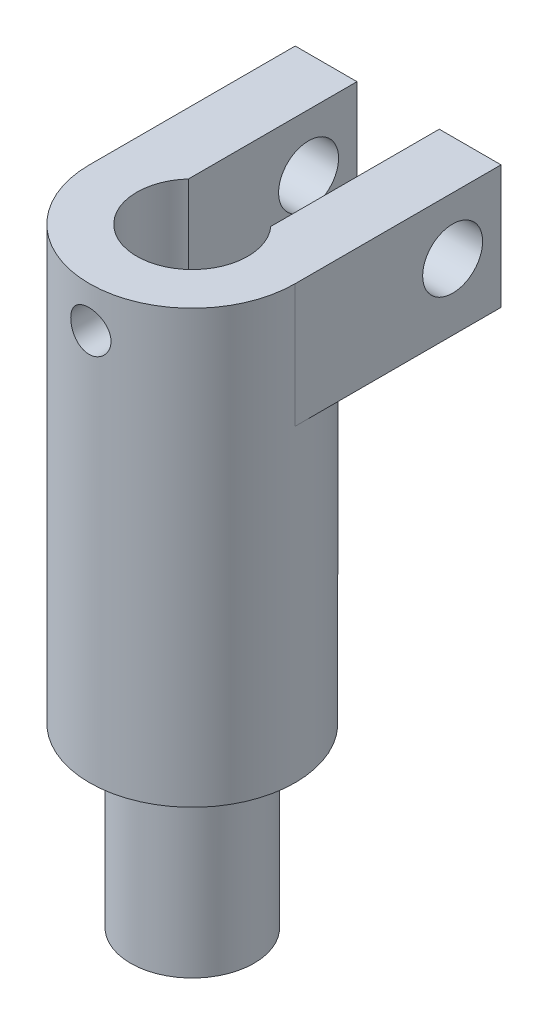
ISO-10303-21;
HEADER;
FILE_DESCRIPTION(('STEP AP214'),'2;1');
FILE_NAME('part.step','',(''),(''),'','','');
FILE_SCHEMA(('AUTOMOTIVE_DESIGN { 1 0 10303 214 1 1 1 1 }'));
ENDSEC;
DATA;
#1=APPLICATION_CONTEXT('core data for automotive mechanical design processes');
#2=APPLICATION_PROTOCOL_DEFINITION('international standard','automotive_design',2000,#1);
#3=PRODUCT_CONTEXT('',#1,'mechanical');
#4=PRODUCT('Part','Part','',(#3));
#5=PRODUCT_RELATED_PRODUCT_CATEGORY('part','',(#4));
#6=PRODUCT_DEFINITION_FORMATION('','',#4);
#7=PRODUCT_DEFINITION_CONTEXT('part definition',#1,'design');
#8=PRODUCT_DEFINITION('design','',#6,#7);
#9=PRODUCT_DEFINITION_SHAPE('','',#8);
#10=(LENGTH_UNIT() NAMED_UNIT(*) SI_UNIT(.MILLI.,.METRE.));
#11=(NAMED_UNIT(*) PLANE_ANGLE_UNIT() SI_UNIT($,.RADIAN.));
#12=(NAMED_UNIT(*) SI_UNIT($,.STERADIAN.) SOLID_ANGLE_UNIT());
#13=UNCERTAINTY_MEASURE_WITH_UNIT(LENGTH_MEASURE(1.E-05),#10,'distance_accuracy_value','');
#14=(GEOMETRIC_REPRESENTATION_CONTEXT(3) GLOBAL_UNCERTAINTY_ASSIGNED_CONTEXT((#13)) GLOBAL_UNIT_ASSIGNED_CONTEXT((#10,
#11,#12)) REPRESENTATION_CONTEXT('',''));
#15=CARTESIAN_POINT('',(0.,0.,0.));
#16=DIRECTION('',(0.,0.,1.));
#17=DIRECTION('',(1.,0.,0.));
#18=AXIS2_PLACEMENT_3D('',#15,#16,#17);
#19=CARTESIAN_POINT('',(0.,19.05,0.));
#20=DIRECTION('',(0.,-1.,0.));
#21=DIRECTION('',(0.,0.,-1.));
#22=AXIS2_PLACEMENT_3D('',#19,#20,#21);
#23=CYLINDRICAL_SURFACE('',#22,6.35);
#24=CARTESIAN_POINT('',(1.21684521758331,24.1305728565034,6.23231800508002));
#25=CARTESIAN_POINT('',(1.21684261587254,24.0610935812906,6.23231936501521));
#26=CARTESIAN_POINT('',(1.21102652927377,23.9915813792861,6.23346277432744));
#27=CARTESIAN_POINT('',(1.18793481084357,23.8545217857291,6.23790381193194));
#28=CARTESIAN_POINT('',(1.17064986752788,23.7869760372804,6.24120319060754));
#29=CARTESIAN_POINT('',(1.12517735145092,23.6558521418449,6.24956049252496));
#30=CARTESIAN_POINT('',(1.09700044506115,23.5922701836861,6.25461669484159));
#31=CARTESIAN_POINT('',(1.03057512420649,23.4707337302349,6.26590335020237));
#32=CARTESIAN_POINT('',(0.992327329270661,23.4127788890801,6.2721337310081));
#33=CARTESIAN_POINT('',(0.906290105442708,23.303344249157,6.28514511400288));
#34=CARTESIAN_POINT('',(0.85838918994204,23.2519527796697,6.29193194212927));
#35=CARTESIAN_POINT('',(0.754649736987168,23.1578744301423,6.30521477535255));
#36=CARTESIAN_POINT('',(0.698810652833277,23.1151881501197,6.31171076037859));
#37=CARTESIAN_POINT('',(0.580198912301908,23.0393902322941,6.32372095716737));
#38=CARTESIAN_POINT('',(0.517371761218049,23.006362364369,6.32922642859708));
#39=CARTESIAN_POINT('',(0.386934397922873,22.9513591454428,6.33853700354256));
#40=CARTESIAN_POINT('',(0.31932461997357,22.9293827924308,6.3423422612086));
#41=CARTESIAN_POINT('',(0.182159627580712,22.8973809278278,6.34775286757285));
#42=CARTESIAN_POINT('',(0.112640302028554,22.8872063246456,6.34938570022244));
#43=CARTESIAN_POINT('',(-0.0271332978839639,22.8786317778989,6.35032644425796));
#44=CARTESIAN_POINT('',(-0.0973875029326157,22.8802307337092,6.34963457296697));
#45=CARTESIAN_POINT('',(-0.235612908961461,22.8950445105335,6.34599899004458));
#46=CARTESIAN_POINT('',(-0.303602235482833,22.908098751961,6.3430864809231));
#47=CARTESIAN_POINT('',(-0.436395572457386,22.9451980247793,6.3353362618724));
#48=CARTESIAN_POINT('',(-0.501199458200458,22.9692434860978,6.33049847663591));
#49=CARTESIAN_POINT('',(-0.626244171054954,23.0277924894609,6.31935808623323));
#50=CARTESIAN_POINT('',(-0.686454572423691,23.0623592721494,6.31304667850881));
#51=CARTESIAN_POINT('',(-0.800275133784891,23.1409229497347,6.29963086367204));
#52=CARTESIAN_POINT('',(-0.853884555893777,23.1849208973805,6.29252636807413));
#53=CARTESIAN_POINT('',(-0.953936194768653,23.281979913835,6.27814525323135));
#54=CARTESIAN_POINT('',(-1.00024206643724,23.3351815054548,6.27086775351528));
#55=CARTESIAN_POINT('',(-1.08329948369989,23.4486720500017,6.25705524320718));
#56=CARTESIAN_POINT('',(-1.12005085967777,23.5089611287219,6.25052024579759));
#57=CARTESIAN_POINT('',(-1.18300380605068,23.6351071847573,6.23891285709015));
#58=CARTESIAN_POINT('',(-1.20918390404575,23.7009751691129,6.2338434485689));
#59=CARTESIAN_POINT('',(-1.25007645516499,23.8362987798549,6.22577285757166));
#60=CARTESIAN_POINT('',(-1.26479035212137,23.9057539533652,6.22277141470148));
#61=CARTESIAN_POINT('',(-1.28213186735071,24.0450462877231,6.21922148028519));
#62=CARTESIAN_POINT('',(-1.28495590050041,24.1148580062266,6.21863312985599));
#63=CARTESIAN_POINT('',(-1.27896579689437,24.2539556380752,6.21986780655312));
#64=CARTESIAN_POINT('',(-1.27015229817714,24.323241580037,6.22169070148069));
#65=CARTESIAN_POINT('',(-1.24130565002856,24.4586637213851,6.2275092349967));
#66=CARTESIAN_POINT('',(-1.22137694226979,24.524823112148,6.23148463799522));
#67=CARTESIAN_POINT('',(-1.17097531614875,24.6528603728247,6.24115143771146));
#68=CARTESIAN_POINT('',(-1.14050155244561,24.714737899007,6.24684297199757));
#69=CARTESIAN_POINT('',(-1.06942583608198,24.8333168385259,6.25940430769089));
#70=CARTESIAN_POINT('',(-1.02870062028006,24.8899428592418,6.26628810539752));
#71=CARTESIAN_POINT('',(-0.938439745086084,24.9956227777171,6.28043890940152));
#72=CARTESIAN_POINT('',(-0.888903208579268,25.0446759207326,6.28770595379812));
#73=CARTESIAN_POINT('',(-0.7815418653437,25.1345603253641,6.30195701712605));
#74=CARTESIAN_POINT('',(-0.723605006480432,25.1752588234249,6.30893523824578));
#75=CARTESIAN_POINT('',(-0.601596313151397,25.2463381801802,6.32173542741158));
#76=CARTESIAN_POINT('',(-0.537524731190133,25.2767194632963,6.32755744301665));
#77=CARTESIAN_POINT('',(-0.405416329000121,25.3261071151362,6.33738876061472));
#78=CARTESIAN_POINT('',(-0.337403894298544,25.3451766331101,6.34140809496416));
#79=CARTESIAN_POINT('',(-0.199050821647502,25.3715999126203,6.3472567811785));
#80=CARTESIAN_POINT('',(-0.128710455913117,25.3789550390648,6.34908638817441));
#81=CARTESIAN_POINT('',(0.011033059095354,25.3816892628891,6.35036845805138));
#82=CARTESIAN_POINT('',(0.0804320133754336,25.3772681979364,6.34986048198307));
#83=CARTESIAN_POINT('',(0.217489219952048,25.3570158580192,6.34664466466648));
#84=CARTESIAN_POINT('',(0.285147492738241,25.3411847174271,6.34393684932486));
#85=CARTESIAN_POINT('',(0.416681733376486,25.2986492641783,6.33665602877347));
#86=CARTESIAN_POINT('',(0.480565475213622,25.2719682603485,6.33208702193665));
#87=CARTESIAN_POINT('',(0.602985840305976,25.208515370521,6.32160479305524));
#88=CARTESIAN_POINT('',(0.661522056813175,25.1717427177741,6.31569146887717));
#89=CARTESIAN_POINT('',(0.772573782672892,25.0884727172897,6.30307907403932));
#90=CARTESIAN_POINT('',(0.824980594623876,25.0418320355287,6.29636914431578));
#91=CARTESIAN_POINT('',(0.921292744849762,24.9404452025644,6.28300005396996));
#92=CARTESIAN_POINT('',(0.96519607093643,24.885697138298,6.27634090572138));
#93=CARTESIAN_POINT('',(1.04368340159875,24.7689687739532,6.26377087728518));
#94=CARTESIAN_POINT('',(1.0781660123393,24.706919344407,6.25786847544866));
#95=CARTESIAN_POINT('',(1.13615349983306,24.5778109724903,6.24760189239332));
#96=CARTESIAN_POINT('',(1.1596684395246,24.5107566879207,6.24323630204161));
#97=CARTESIAN_POINT('',(1.19043439712732,24.3913775561549,6.23743042635978));
#98=CARTESIAN_POINT('',(1.2003208819913,24.3397383884156,6.23552525115882));
#99=CARTESIAN_POINT('',(1.21352716887615,24.2355966856297,6.23296854688181));
#100=CARTESIAN_POINT('',(1.21684718428905,24.1830941786952,6.23231697706708));
#101=CARTESIAN_POINT('',(1.21684521758331,24.1305728565034,6.23231800508002));
#102=B_SPLINE_CURVE_WITH_KNOTS('',3,(#24,#25,#26,#27,#28,#29,#30,#31,#32,#33,#34,#35,#36,#37,
#38,#39,#40,#41,#42,#43,#44,#45,#46,#47,#48,#49,#50,#51,#52,#53,#54,#55,#56,#57,#58,#59,#60,#61,
#62,#63,#64,#65,#66,#67,#68,#69,#70,#71,#72,#73,#74,#75,#76,#77,#78,#79,#80,#81,#82,#83,#84,#85,
#86,#87,#88,#89,#90,#91,#92,#93,#94,#95,#96,#97,#98,#99,#100,#101),.UNSPECIFIED.,.T.,.F.,(4,2,2,
2,2,2,2,2,2,2,2,2,2,2,2,2,2,2,2,2,2,2,2,2,2,2,2,2,2,2,2,2,2,2,2,2,2,2,4),(0.,0.208245547253058,
0.416660374824381,0.624871619155631,0.833070057984128,1.04382718376134,1.25459883136701,
1.46714773742559,1.67967736877747,1.88949181939235,2.09928665621642,2.30618675357124,
2.51309494463053,2.72127221912448,2.92947274341199,3.14118972183833,3.35291045851377,
3.56505910524068,3.77718103373993,3.98578471554462,4.19437696093309,4.40104145434086,
4.60772251877809,4.8170184971263,5.0263353213202,5.23875728413995,5.45117050745142,
5.66238646820454,5.87357781722348,6.08120825351499,6.28883624465786,6.49602052413559,
6.70322054954174,6.91366685640683,7.12416290071183,7.33684243187158,7.54932644188322,
7.70675017578221,7.86416879376241),.UNSPECIFIED.);
#103=CARTESIAN_POINT('',(1.21684521758331,24.1305728565034,6.23231800508002));
#104=VERTEX_POINT('',#103);
#105=EDGE_CURVE('E11',#104,#104,#102,.T.);
#106=ORIENTED_EDGE('',*,*,#105,.T.);
#107=EDGE_LOOP('',(#106));
#108=FACE_BOUND('',#107,.T.);
#109=CARTESIAN_POINT('',(0.,0.,0.));
#110=DIRECTION('',(0.,1.,0.));
#111=DIRECTION('',(0.,0.,1.));
#112=AXIS2_PLACEMENT_3D('',#109,#110,#111);
#113=CIRCLE('',#112,6.35);
#114=CARTESIAN_POINT('',(0.,0.,6.35));
#115=VERTEX_POINT('',#114);
#116=EDGE_CURVE('E203',#115,#115,#113,.T.);
#117=ORIENTED_EDGE('',*,*,#116,.T.);
#118=EDGE_LOOP('',(#117));
#119=FACE_BOUND('',#118,.T.);
#120=DIRECTION('',(0.,1.,0.));
#121=VECTOR('',#120,1.);
#122=CARTESIAN_POINT('',(2.54,17.78,-5.81987113259392));
#123=LINE('',#122,#121);
#124=CARTESIAN_POINT('',(2.54,17.78,-5.81987113259392));
#125=VERTEX_POINT('',#124);
#126=CARTESIAN_POINT('',(2.54,19.05,-5.81987113259392));
#127=VERTEX_POINT('',#126);
#128=EDGE_CURVE('E142',#125,#127,#123,.T.);
#129=ORIENTED_EDGE('',*,*,#128,.T.);
#130=CARTESIAN_POINT('',(0.,19.05,0.));
#131=DIRECTION('',(0.,1.,0.));
#132=DIRECTION('',(0.,0.,1.));
#133=AXIS2_PLACEMENT_3D('',#130,#131,#132);
#134=CIRCLE('',#133,6.35);
#135=CARTESIAN_POINT('',(6.35,19.05,0.));
#136=VERTEX_POINT('',#135);
#137=EDGE_CURVE('E204',#136,#127,#134,.T.);
#138=ORIENTED_EDGE('',*,*,#137,.F.);
#139=DIRECTION('',(0.,-1.,0.));
#140=VECTOR('',#139,1.);
#141=CARTESIAN_POINT('',(6.35,26.67,0.));
#142=LINE('',#141,#140);
#143=CARTESIAN_POINT('',(6.35,26.67,0.));
#144=VERTEX_POINT('',#143);
#145=EDGE_CURVE('E188',#144,#136,#142,.T.);
#146=ORIENTED_EDGE('',*,*,#145,.F.);
#147=CARTESIAN_POINT('',(0.,26.67,0.));
#148=DIRECTION('',(0.,1.,0.));
#149=DIRECTION('',(0.,0.,1.));
#150=AXIS2_PLACEMENT_3D('',#147,#148,#149);
#151=CIRCLE('',#150,6.35);
#152=CARTESIAN_POINT('',(-6.35,26.67,0.));
#153=VERTEX_POINT('',#152);
#154=EDGE_CURVE('E161',#153,#144,#151,.T.);
#155=ORIENTED_EDGE('',*,*,#154,.F.);
#156=DIRECTION('',(0.,-1.,0.));
#157=VECTOR('',#156,1.);
#158=CARTESIAN_POINT('',(-6.35,26.67,0.));
#159=LINE('',#158,#157);
#160=CARTESIAN_POINT('',(-6.35,19.05,0.));
#161=VERTEX_POINT('',#160);
#162=EDGE_CURVE('E191',#153,#161,#159,.T.);
#163=ORIENTED_EDGE('',*,*,#162,.T.);
#164=CARTESIAN_POINT('',(-2.54,19.05,-5.81987113259392));
#165=VERTEX_POINT('',#164);
#166=EDGE_CURVE('E60',#165,#161,#134,.T.);
#167=ORIENTED_EDGE('',*,*,#166,.F.);
#168=DIRECTION('',(0.,1.,0.));
#169=VECTOR('',#168,1.);
#170=CARTESIAN_POINT('',(-2.54,17.78,-5.81987113259392));
#171=LINE('',#170,#169);
#172=CARTESIAN_POINT('',(-2.54,17.78,-5.81987113259392));
#173=VERTEX_POINT('',#172);
#174=EDGE_CURVE('E118',#173,#165,#171,.T.);
#175=ORIENTED_EDGE('',*,*,#174,.F.);
#176=CARTESIAN_POINT('',(0.,17.78,0.));
#177=DIRECTION('',(0.,1.,0.));
#178=DIRECTION('',(0.,0.,1.));
#179=AXIS2_PLACEMENT_3D('',#176,#177,#178);
#180=CIRCLE('',#179,6.35);
#181=EDGE_CURVE('E123',#125,#173,#180,.T.);
#182=ORIENTED_EDGE('',*,*,#181,.F.);
#183=EDGE_LOOP('',(#129,#138,#146,#155,#163,#167,#175,#182));
#184=FACE_BOUND('',#183,.T.);
#185=ADVANCED_FACE('F34',(#108,#119,#184),#23,.T.);
#186=CARTESIAN_POINT('',(0.,26.67,0.));
#187=DIRECTION('',(0.,1.,0.));
#188=DIRECTION('',(0.,0.,1.));
#189=AXIS2_PLACEMENT_3D('',#186,#187,#188);
#190=PLANE('',#189);
#191=DIRECTION('',(0.,0.,1.));
#192=VECTOR('',#191,1.);
#193=CARTESIAN_POINT('',(2.54,26.67,0.));
#194=LINE('',#193,#192);
#195=CARTESIAN_POINT('',(2.54,26.67,-12.7));
#196=VERTEX_POINT('',#195);
#197=CARTESIAN_POINT('',(2.54,26.67,-2.30357135769657));
#198=VERTEX_POINT('',#197);
#199=EDGE_CURVE('E150',#196,#198,#194,.T.);
#200=ORIENTED_EDGE('',*,*,#199,.T.);
#201=CARTESIAN_POINT('',(0.,26.67,0.));
#202=DIRECTION('',(0.,1.,0.));
#203=DIRECTION('',(0.,0.,1.));
#204=AXIS2_PLACEMENT_3D('',#201,#202,#203);
#205=CIRCLE('',#204,3.429);
#206=CARTESIAN_POINT('',(-2.54,26.67,-2.30357135769657));
#207=VERTEX_POINT('',#206);
#208=EDGE_CURVE('E167',#198,#207,#205,.F.);
#209=ORIENTED_EDGE('',*,*,#208,.T.);
#210=DIRECTION('',(0.,0.,1.));
#211=VECTOR('',#210,1.);
#212=CARTESIAN_POINT('',(-2.54,26.67,0.));
#213=LINE('',#212,#211);
#214=CARTESIAN_POINT('',(-2.54,26.67,-12.7));
#215=VERTEX_POINT('',#214);
#216=EDGE_CURVE('E152',#215,#207,#213,.T.);
#217=ORIENTED_EDGE('',*,*,#216,.F.);
#218=DIRECTION('',(1.,0.,0.));
#219=VECTOR('',#218,1.);
#220=CARTESIAN_POINT('',(0.,26.67,-12.7));
#221=LINE('',#220,#219);
#222=CARTESIAN_POINT('',(-6.35,26.67,-12.7));
#223=VERTEX_POINT('',#222);
#224=EDGE_CURVE('E155',#223,#215,#221,.T.);
#225=ORIENTED_EDGE('',*,*,#224,.F.);
#226=DIRECTION('',(0.,0.,-1.));
#227=VECTOR('',#226,1.);
#228=CARTESIAN_POINT('',(-6.35,26.67,0.));
#229=LINE('',#228,#227);
#230=EDGE_CURVE('E158',#153,#223,#229,.T.);
#231=ORIENTED_EDGE('',*,*,#230,.F.);
#232=ORIENTED_EDGE('',*,*,#154,.T.);
#233=DIRECTION('',(0.,0.,-1.));
#234=VECTOR('',#233,1.);
#235=CARTESIAN_POINT('',(6.35,26.67,0.));
#236=LINE('',#235,#234);
#237=CARTESIAN_POINT('',(6.35,26.67,-12.7));
#238=VERTEX_POINT('',#237);
#239=EDGE_CURVE('E163',#144,#238,#236,.T.);
#240=ORIENTED_EDGE('',*,*,#239,.T.);
#241=DIRECTION('',(-1.,0.,0.));
#242=VECTOR('',#241,1.);
#243=CARTESIAN_POINT('',(0.,26.67,-12.7));
#244=LINE('',#243,#242);
#245=EDGE_CURVE('E165',#238,#196,#244,.T.);
#246=ORIENTED_EDGE('',*,*,#245,.T.);
#247=EDGE_LOOP('',(#200,#209,#217,#225,#231,#232,#240,#246));
#248=FACE_BOUND('',#247,.T.);
#249=ADVANCED_FACE('F246',(#248),#190,.T.);
#250=CARTESIAN_POINT('',(0.,19.05,0.));
#251=DIRECTION('',(0.,-1.,0.));
#252=DIRECTION('',(0.,0.,-1.));
#253=AXIS2_PLACEMENT_3D('',#250,#251,#252);
#254=CYLINDRICAL_SURFACE('',#253,3.429);
#255=CARTESIAN_POINT('',(1.23298704834135,24.1305728565034,3.19965372167403));
#256=CARTESIAN_POINT('',(1.23298894138451,24.0629141911514,3.19965203422019));
#257=CARTESIAN_POINT('',(1.22746396268422,23.9952683343074,3.20179822116886));
#258=CARTESIAN_POINT('',(1.20560477514785,23.8620070261721,3.21009233773209));
#259=CARTESIAN_POINT('',(1.18927039783664,23.7963916065439,3.2162403297187));
#260=CARTESIAN_POINT('',(1.1464667548226,23.6691497323997,3.23174353982911));
#261=CARTESIAN_POINT('',(1.12002058526365,23.6075145589535,3.24109144403865));
#262=CARTESIAN_POINT('',(1.05782939677662,23.4895242181139,3.26191812499198));
#263=CARTESIAN_POINT('',(1.02208175717013,23.4331705448732,3.27339750201429));
#264=CARTESIAN_POINT('',(0.940511024715029,23.324698920142,3.29778172105604));
#265=CARTESIAN_POINT('',(0.894323264494175,23.2728640986771,3.31072647632782));
#266=CARTESIAN_POINT('',(0.793965608415687,23.1774663617177,3.33621602985955));
#267=CARTESIAN_POINT('',(0.739794131317801,23.1339050887876,3.34876074828888));
#268=CARTESIAN_POINT('',(0.622881419280664,23.0549480857558,3.37249527149772));
#269=CARTESIAN_POINT('',(0.559921912010221,23.0198572130024,3.38362907942));
#270=CARTESIAN_POINT('',(0.428517620617795,22.9608709662855,3.40276549333998));
#271=CARTESIAN_POINT('',(0.360074635070031,22.9369719388733,3.4107691210081));
#272=CARTESIAN_POINT('',(0.222626104876916,22.9020321376253,3.42243160954799));
#273=CARTESIAN_POINT('',(0.153758559758684,22.8905045580747,3.42625508122438));
#274=CARTESIAN_POINT('',(0.0149697138487343,22.8790782026131,3.4296689829093));
#275=CARTESIAN_POINT('',(-0.0549512564407654,22.879175852354,3.42926071406413));
#276=CARTESIAN_POINT('',(-0.190384996515524,22.8907070567972,3.42435030865921));
#277=CARTESIAN_POINT('',(-0.255950944009293,22.9016099709224,3.42004062520565));
#278=CARTESIAN_POINT('',(-0.3842308035581,22.9335535556358,3.40801410003253));
#279=CARTESIAN_POINT('',(-0.446944514811667,22.9545949387812,3.40029701883564));
#280=CARTESIAN_POINT('',(-0.568801297681173,23.0064806562533,3.38206431836082));
#281=CARTESIAN_POINT('',(-0.6278807167634,23.037460471948,3.3715103695855));
#282=CARTESIAN_POINT('',(-0.740135777956944,23.1082261117978,3.34866037776356));
#283=CARTESIAN_POINT('',(-0.793309568070126,23.1480146867255,3.33636379096385));
#284=CARTESIAN_POINT('',(-0.895379964077301,23.2378564617887,3.31047756208975));
#285=CARTESIAN_POINT('',(-0.943874626401038,23.2883572325605,3.29685403752263));
#286=CARTESIAN_POINT('',(-1.03185563015451,23.3968764374724,3.27038693231001));
#287=CARTESIAN_POINT('',(-1.07133995853954,23.4548965470155,3.25754352642422));
#288=CARTESIAN_POINT('',(-1.140894050871,23.5783098745874,3.23384965370439));
#289=CARTESIAN_POINT('',(-1.17076015840828,23.6438271496566,3.22304408529405));
#290=CARTESIAN_POINT('',(-1.21890616184934,23.7794602499948,3.2051484203254));
#291=CARTESIAN_POINT('',(-1.23719208018207,23.8495736640098,3.19805639282443));
#292=CARTESIAN_POINT('',(-1.2607755648096,23.9884571162983,3.18883032837491));
#293=CARTESIAN_POINT('',(-1.26670629028837,24.0571035211052,3.18645490813406));
#294=CARTESIAN_POINT('',(-1.26723037800647,24.1944378427134,3.18624694904064));
#295=CARTESIAN_POINT('',(-1.2618263551177,24.2631257462865,3.18841336240887));
#296=CARTESIAN_POINT('',(-1.24040615038938,24.395439190058,3.19680372863422));
#297=CARTESIAN_POINT('',(-1.22486595503584,24.4591546183217,3.20284549607489));
#298=CARTESIAN_POINT('',(-1.18420349268783,24.5830437372816,3.21810057128577));
#299=CARTESIAN_POINT('',(-1.15907932869996,24.6432167240846,3.22731450690076));
#300=CARTESIAN_POINT('',(-1.09893492310771,24.760726104636,3.24829640020712));
#301=CARTESIAN_POINT('',(-1.06359020581945,24.8178817065743,3.26014454323805));
#302=CARTESIAN_POINT('',(-0.984353386004034,24.9256666348378,3.28493689574598));
#303=CARTESIAN_POINT('',(-0.940458307103944,24.976293678349,3.2978814860059));
#304=CARTESIAN_POINT('',(-0.842277981972751,25.0726960768847,3.32435554758454));
#305=CARTESIAN_POINT('',(-0.787530931637877,25.1180056474752,3.33787417846687));
#306=CARTESIAN_POINT('',(-0.670876741634528,25.198831850604,3.36326087902295));
#307=CARTESIAN_POINT('',(-0.608969667184579,25.2343485723323,3.37512896372887));
#308=CARTESIAN_POINT('',(-0.479871177706285,25.2943159199622,3.39588202034317));
#309=CARTESIAN_POINT('',(-0.412704781836588,25.3188155983393,3.40478016904056));
#310=CARTESIAN_POINT('',(-0.274804145462453,25.3560334011698,3.41867170550779));
#311=CARTESIAN_POINT('',(-0.204071492713388,25.3687567206519,3.42366681491468));
#312=CARTESIAN_POINT('',(-0.0652655126787266,25.3815238171331,3.42904336276884));
#313=CARTESIAN_POINT('',(0.00273806752639151,25.3822309558008,3.42966505515827));
#314=CARTESIAN_POINT('',(0.137873191068258,25.3726337117982,3.42689329975636));
#315=CARTESIAN_POINT('',(0.205004829182205,25.3623305362241,3.42350029210511));
#316=CARTESIAN_POINT('',(0.334993531610091,25.3314657061286,3.4132070752444));
#317=CARTESIAN_POINT('',(0.397912179867179,25.3111350093926,3.40638576380319));
#318=CARTESIAN_POINT('',(0.519471182391163,25.2610175736076,3.38997883564241));
#319=CARTESIAN_POINT('',(0.57811072775156,25.2312290523505,3.38039269795728));
#320=CARTESIAN_POINT('',(0.69206788251086,25.1616505332758,3.35895562981177));
#321=CARTESIAN_POINT('',(0.747151444334345,25.121501224011,3.34702808914432));
#322=CARTESIAN_POINT('',(0.85001272667106,25.0329184503895,3.32239696961433));
#323=CARTESIAN_POINT('',(0.897787891102829,24.9844821001648,3.30969312140554));
#324=CARTESIAN_POINT('',(0.987081919999506,24.8778639966032,3.28420064861491));
#325=CARTESIAN_POINT('',(1.02817761055397,24.8193201448307,3.27143857443839));
#326=CARTESIAN_POINT('',(1.09994092023403,24.6957573869433,3.24801504676221));
#327=CARTESIAN_POINT('',(1.13060853434493,24.6307384777147,3.2373535942727));
#328=CARTESIAN_POINT('',(1.18094934079255,24.494580548189,3.21933787897704));
#329=CARTESIAN_POINT('',(1.20038685312094,24.4233441243989,3.21205510142296));
#330=CARTESIAN_POINT('',(1.22640105680113,24.2782566717097,3.20221527262515));
#331=CARTESIAN_POINT('',(1.23298498250869,24.2044071373867,3.19965556315199));
#332=CARTESIAN_POINT('',(1.23298704834135,24.1305728565034,3.19965372167403));
#333=B_SPLINE_CURVE_WITH_KNOTS('',3,(#255,#256,#257,#258,#259,#260,#261,#262,#263,#264,#265,
#266,#267,#268,#269,#270,#271,#272,#273,#274,#275,#276,#277,#278,#279,#280,#281,#282,#283,#284,
#285,#286,#287,#288,#289,#290,#291,#292,#293,#294,#295,#296,#297,#298,#299,#300,#301,#302,#303,
#304,#305,#306,#307,#308,#309,#310,#311,#312,#313,#314,#315,#316,#317,#318,#319,#320,#321,#322,
#323,#324,#325,#326,#327,#328,#329,#330,#331,#332),.UNSPECIFIED.,.T.,.F.,(4,2,2,2,2,2,2,2,2,2,2,
2,2,2,2,2,2,2,2,2,2,2,2,2,2,2,2,2,2,2,2,2,2,2,2,2,2,2,4),(0.,0.202701447575467,
0.405406054526968,0.607650407299796,0.80995180400246,1.02088063697836,1.23185130241231,
1.4495528600967,1.66718330199267,1.87589505742308,2.08454264151173,2.28342724101597,
2.4823258206719,2.68406004567353,2.88585735670995,3.09886970225356,3.31192959148184,
3.52924237095279,3.74644204105693,3.95220592419586,4.15792234381833,4.35461341601982,
4.5513434402931,4.7551746722336,4.95907698484427,5.17507164020703,5.39106432829379,
5.6060855666667,5.82101190519002,6.02403199359945,6.22702982654751,6.42555631558067,
6.62412023666056,6.83080756387515,7.03756701465581,7.2544936987869,7.47142048723426,
7.6927483271165,7.91395156158583),.UNSPECIFIED.);
#334=CARTESIAN_POINT('',(1.23298704834135,24.1305728565034,3.19965372167403));
#335=VERTEX_POINT('',#334);
#336=EDGE_CURVE('E130',#335,#335,#333,.T.);
#337=ORIENTED_EDGE('',*,*,#336,.F.);
#338=EDGE_LOOP('',(#337));
#339=FACE_BOUND('',#338,.T.);
#340=CARTESIAN_POINT('',(0.,0.,0.));
#341=DIRECTION('',(0.,1.,0.));
#342=DIRECTION('',(0.,0.,1.));
#343=AXIS2_PLACEMENT_3D('',#340,#341,#342);
#344=CIRCLE('',#343,3.429);
#345=CARTESIAN_POINT('',(0.,0.,3.429));
#346=VERTEX_POINT('',#345);
#347=EDGE_CURVE('E200',#346,#346,#344,.T.);
#348=ORIENTED_EDGE('',*,*,#347,.F.);
#349=EDGE_LOOP('',(#348));
#350=FACE_BOUND('',#349,.T.);
#351=ORIENTED_EDGE('',*,*,#208,.F.);
#352=DIRECTION('',(0.,1.,0.));
#353=VECTOR('',#352,1.);
#354=CARTESIAN_POINT('',(2.54,17.78,-2.30357135769657));
#355=LINE('',#354,#353);
#356=CARTESIAN_POINT('',(2.54,17.78,-2.30357135769657));
#357=VERTEX_POINT('',#356);
#358=EDGE_CURVE('E133',#357,#198,#355,.T.);
#359=ORIENTED_EDGE('',*,*,#358,.F.);
#360=CARTESIAN_POINT('',(0.,17.78,0.));
#361=DIRECTION('',(0.,1.,0.));
#362=DIRECTION('',(0.,0.,1.));
#363=AXIS2_PLACEMENT_3D('',#360,#361,#362);
#364=CIRCLE('',#363,3.429);
#365=CARTESIAN_POINT('',(-2.54,17.78,-2.30357135769657));
#366=VERTEX_POINT('',#365);
#367=EDGE_CURVE('E122',#366,#357,#364,.F.);
#368=ORIENTED_EDGE('',*,*,#367,.F.);
#369=DIRECTION('',(0.,1.,0.));
#370=VECTOR('',#369,1.);
#371=CARTESIAN_POINT('',(-2.54,17.78,-2.30357135769657));
#372=LINE('',#371,#370);
#373=EDGE_CURVE('E120',#366,#207,#372,.T.);
#374=ORIENTED_EDGE('',*,*,#373,.T.);
#375=EDGE_LOOP('',(#351,#359,#368,#374));
#376=FACE_BOUND('',#375,.T.);
#377=ADVANCED_FACE('F258',(#339,#350,#376),#254,.F.);
#378=CARTESIAN_POINT('',(0.,0.,0.));
#379=DIRECTION('',(0.,1.,0.));
#380=DIRECTION('',(0.,0.,1.));
#381=AXIS2_PLACEMENT_3D('',#378,#379,#380);
#382=PLANE('',#381);
#383=CARTESIAN_POINT('',(0.,0.,0.));
#384=DIRECTION('',(0.,1.,0.));
#385=DIRECTION('',(0.,0.,1.));
#386=AXIS2_PLACEMENT_3D('',#383,#384,#385);
#387=CIRCLE('',#386,3.81);
#388=CARTESIAN_POINT('',(0.,0.,3.81));
#389=VERTEX_POINT('',#388);
#390=EDGE_CURVE('E45',#389,#389,#387,.F.);
#391=ORIENTED_EDGE('',*,*,#390,.F.);
#392=EDGE_LOOP('',(#391));
#393=FACE_BOUND('',#392,.T.);
#394=ORIENTED_EDGE('',*,*,#116,.F.);
#395=EDGE_LOOP('',(#394));
#396=FACE_BOUND('',#395,.T.);
#397=ADVANCED_FACE('F298',(#393,#396),#382,.F.);
#398=CARTESIAN_POINT('',(0.,-10.922,0.));
#399=DIRECTION('',(0.,1.,0.));
#400=DIRECTION('',(0.,0.,1.));
#401=AXIS2_PLACEMENT_3D('',#398,#399,#400);
#402=CYLINDRICAL_SURFACE('',#401,3.81);
#403=CARTESIAN_POINT('',(0.,-10.922,0.));
#404=DIRECTION('',(0.,-1.,0.));
#405=DIRECTION('',(0.,0.,-1.));
#406=AXIS2_PLACEMENT_3D('',#403,#404,#405);
#407=CIRCLE('',#406,3.81);
#408=CARTESIAN_POINT('',(0.,-10.922,-3.81));
#409=VERTEX_POINT('',#408);
#410=EDGE_CURVE('E197',#409,#409,#407,.T.);
#411=ORIENTED_EDGE('',*,*,#410,.F.);
#412=EDGE_LOOP('',(#411));
#413=FACE_BOUND('',#412,.T.);
#414=ORIENTED_EDGE('',*,*,#390,.T.);
#415=EDGE_LOOP('',(#414));
#416=FACE_BOUND('',#415,.T.);
#417=ADVANCED_FACE('F293',(#413,#416),#402,.T.);
#418=CARTESIAN_POINT('',(0.,-10.922,0.));
#419=DIRECTION('',(0.,-1.,0.));
#420=DIRECTION('',(0.,0.,-1.));
#421=AXIS2_PLACEMENT_3D('',#418,#419,#420);
#422=PLANE('',#421);
#423=ORIENTED_EDGE('',*,*,#410,.T.);
#424=EDGE_LOOP('',(#423));
#425=FACE_BOUND('',#424,.T.);
#426=ADVANCED_FACE('F276',(#425),#422,.T.);
#427=CARTESIAN_POINT('',(0.,19.05,0.));
#428=DIRECTION('',(0.,1.,0.));
#429=DIRECTION('',(0.,0.,1.));
#430=AXIS2_PLACEMENT_3D('',#427,#428,#429);
#431=PLANE('',#430);
#432=DIRECTION('',(0.,0.,-1.));
#433=VECTOR('',#432,1.);
#434=CARTESIAN_POINT('',(6.35,19.05,0.));
#435=LINE('',#434,#433);
#436=CARTESIAN_POINT('',(6.35,19.05,-12.7));
#437=VERTEX_POINT('',#436);
#438=EDGE_CURVE('E180',#136,#437,#435,.T.);
#439=ORIENTED_EDGE('',*,*,#438,.F.);
#440=ORIENTED_EDGE('',*,*,#137,.T.);
#441=DIRECTION('',(0.,0.,1.));
#442=VECTOR('',#441,1.);
#443=CARTESIAN_POINT('',(2.54,19.05,0.));
#444=LINE('',#443,#442);
#445=CARTESIAN_POINT('',(2.54,19.05,-12.7));
#446=VERTEX_POINT('',#445);
#447=EDGE_CURVE('E149',#446,#127,#444,.T.);
#448=ORIENTED_EDGE('',*,*,#447,.F.);
#449=DIRECTION('',(-1.,0.,0.));
#450=VECTOR('',#449,1.);
#451=CARTESIAN_POINT('',(0.,19.05,-12.7));
#452=LINE('',#451,#450);
#453=EDGE_CURVE('E153',#437,#446,#452,.T.);
#454=ORIENTED_EDGE('',*,*,#453,.F.);
#455=EDGE_LOOP('',(#439,#440,#448,#454));
#456=FACE_BOUND('',#455,.T.);
#457=ADVANCED_FACE('F240',(#456),#431,.F.);
#458=DIRECTION('',(0.,0.,1.));
#459=VECTOR('',#458,1.);
#460=CARTESIAN_POINT('',(-2.54,19.05,0.));
#461=LINE('',#460,#459);
#462=CARTESIAN_POINT('',(-2.54,19.05,-12.7));
#463=VERTEX_POINT('',#462);
#464=EDGE_CURVE('E173',#463,#165,#461,.T.);
#465=ORIENTED_EDGE('',*,*,#464,.T.);
#466=ORIENTED_EDGE('',*,*,#166,.T.);
#467=DIRECTION('',(0.,0.,-1.));
#468=VECTOR('',#467,1.);
#469=CARTESIAN_POINT('',(-6.35,19.05,0.));
#470=LINE('',#469,#468);
#471=CARTESIAN_POINT('',(-6.35,19.05,-12.7));
#472=VERTEX_POINT('',#471);
#473=EDGE_CURVE('E178',#161,#472,#470,.T.);
#474=ORIENTED_EDGE('',*,*,#473,.T.);
#475=DIRECTION('',(1.,0.,0.));
#476=VECTOR('',#475,1.);
#477=CARTESIAN_POINT('',(0.,19.05,-12.7));
#478=LINE('',#477,#476);
#479=EDGE_CURVE('E175',#472,#463,#478,.T.);
#480=ORIENTED_EDGE('',*,*,#479,.T.);
#481=EDGE_LOOP('',(#465,#466,#474,#480));
#482=FACE_BOUND('',#481,.T.);
#483=ADVANCED_FACE('F275',(#482),#431,.F.);
#484=CARTESIAN_POINT('',(2.54,26.67,0.));
#485=DIRECTION('',(1.,0.,0.));
#486=DIRECTION('',(0.,0.,-1.));
#487=AXIS2_PLACEMENT_3D('',#484,#485,#486);
#488=PLANE('',#487);
#489=CARTESIAN_POINT('',(2.54,23.1515387967798,-9.71413950189518));
#490=DIRECTION('',(1.,0.,0.));
#491=DIRECTION('',(0.,0.,-1.));
#492=AXIS2_PLACEMENT_3D('',#489,#490,#491);
#493=CIRCLE('',#492,1.84999999999999);
#494=CARTESIAN_POINT('',(2.54,23.1515387967798,-7.8641395018952));
#495=VERTEX_POINT('',#494);
#496=EDGE_CURVE('E141',#495,#495,#493,.T.);
#497=ORIENTED_EDGE('',*,*,#496,.T.);
#498=EDGE_LOOP('',(#497));
#499=FACE_BOUND('',#498,.T.);
#500=ORIENTED_EDGE('',*,*,#447,.T.);
#501=ORIENTED_EDGE('',*,*,#128,.F.);
#502=DIRECTION('',(0.,0.,1.));
#503=VECTOR('',#502,1.);
#504=CARTESIAN_POINT('',(2.54,17.78,0.));
#505=LINE('',#504,#503);
#506=EDGE_CURVE('E128',#125,#357,#505,.T.);
#507=ORIENTED_EDGE('',*,*,#506,.T.);
#508=ORIENTED_EDGE('',*,*,#358,.T.);
#509=ORIENTED_EDGE('',*,*,#199,.F.);
#510=DIRECTION('',(0.,-1.,0.));
#511=VECTOR('',#510,1.);
#512=CARTESIAN_POINT('',(2.54,26.67,-12.7));
#513=LINE('',#512,#511);
#514=EDGE_CURVE('E170',#196,#446,#513,.T.);
#515=ORIENTED_EDGE('',*,*,#514,.T.);
#516=EDGE_LOOP('',(#500,#501,#507,#508,#509,#515));
#517=FACE_BOUND('',#516,.T.);
#518=ADVANCED_FACE('F213',(#499,#517),#488,.F.);
#519=CARTESIAN_POINT('',(-2.54,26.67,0.));
#520=DIRECTION('',(1.,0.,0.));
#521=DIRECTION('',(0.,0.,-1.));
#522=AXIS2_PLACEMENT_3D('',#519,#520,#521);
#523=PLANE('',#522);
#524=CARTESIAN_POINT('',(-2.54,23.1515387967798,-9.71413950189518));
#525=DIRECTION('',(1.,0.,0.));
#526=DIRECTION('',(0.,0.,-1.));
#527=AXIS2_PLACEMENT_3D('',#524,#525,#526);
#528=CIRCLE('',#527,1.84999999999999);
#529=CARTESIAN_POINT('',(-2.54,23.1515387967798,-11.5641395018952));
#530=VERTEX_POINT('',#529);
#531=EDGE_CURVE('E146',#530,#530,#528,.T.);
#532=ORIENTED_EDGE('',*,*,#531,.F.);
#533=EDGE_LOOP('',(#532));
#534=FACE_BOUND('',#533,.T.);
#535=ORIENTED_EDGE('',*,*,#464,.F.);
#536=DIRECTION('',(0.,-1.,0.));
#537=VECTOR('',#536,1.);
#538=CARTESIAN_POINT('',(-2.54,26.67,-12.7));
#539=LINE('',#538,#537);
#540=EDGE_CURVE('E195',#215,#463,#539,.T.);
#541=ORIENTED_EDGE('',*,*,#540,.F.);
#542=ORIENTED_EDGE('',*,*,#216,.T.);
#543=ORIENTED_EDGE('',*,*,#373,.F.);
#544=DIRECTION('',(0.,0.,1.));
#545=VECTOR('',#544,1.);
#546=CARTESIAN_POINT('',(-2.54,17.78,0.));
#547=LINE('',#546,#545);
#548=EDGE_CURVE('E52',#173,#366,#547,.T.);
#549=ORIENTED_EDGE('',*,*,#548,.F.);
#550=ORIENTED_EDGE('',*,*,#174,.T.);
#551=EDGE_LOOP('',(#535,#541,#542,#543,#549,#550));
#552=FACE_BOUND('',#551,.T.);
#553=ADVANCED_FACE('F116',(#534,#552),#523,.T.);
#554=CARTESIAN_POINT('',(0.,26.67,-12.7));
#555=DIRECTION('',(0.,0.,-1.));
#556=DIRECTION('',(-1.,0.,0.));
#557=AXIS2_PLACEMENT_3D('',#554,#555,#556);
#558=PLANE('',#557);
#559=ORIENTED_EDGE('',*,*,#479,.F.);
#560=DIRECTION('',(0.,-1.,0.));
#561=VECTOR('',#560,1.);
#562=CARTESIAN_POINT('',(-6.35,26.67,-12.7));
#563=LINE('',#562,#561);
#564=EDGE_CURVE('E193',#223,#472,#563,.T.);
#565=ORIENTED_EDGE('',*,*,#564,.F.);
#566=ORIENTED_EDGE('',*,*,#224,.T.);
#567=ORIENTED_EDGE('',*,*,#540,.T.);
#568=EDGE_LOOP('',(#559,#565,#566,#567));
#569=FACE_BOUND('',#568,.T.);
#570=ADVANCED_FACE('F281',(#569),#558,.T.);
#571=CARTESIAN_POINT('',(-6.35,26.67,0.));
#572=DIRECTION('',(-1.,0.,0.));
#573=DIRECTION('',(0.,0.,1.));
#574=AXIS2_PLACEMENT_3D('',#571,#572,#573);
#575=PLANE('',#574);
#576=CARTESIAN_POINT('',(-6.35,23.1515387967798,-9.71413950189518));
#577=DIRECTION('',(-1.,0.,0.));
#578=DIRECTION('',(0.,0.,1.));
#579=AXIS2_PLACEMENT_3D('',#576,#577,#578);
#580=CIRCLE('',#579,1.84999999999999);
#581=CARTESIAN_POINT('',(-6.35,23.1515387967798,-7.8641395018952));
#582=VERTEX_POINT('',#581);
#583=EDGE_CURVE('E138',#582,#582,#580,.T.);
#584=ORIENTED_EDGE('',*,*,#583,.F.);
#585=EDGE_LOOP('',(#584));
#586=FACE_BOUND('',#585,.T.);
#587=ORIENTED_EDGE('',*,*,#473,.F.);
#588=ORIENTED_EDGE('',*,*,#162,.F.);
#589=ORIENTED_EDGE('',*,*,#230,.T.);
#590=ORIENTED_EDGE('',*,*,#564,.T.);
#591=EDGE_LOOP('',(#587,#588,#589,#590));
#592=FACE_BOUND('',#591,.T.);
#593=ADVANCED_FACE('F228',(#586,#592),#575,.T.);
#594=CARTESIAN_POINT('',(6.35,26.67,0.));
#595=DIRECTION('',(-1.,0.,0.));
#596=DIRECTION('',(0.,0.,1.));
#597=AXIS2_PLACEMENT_3D('',#594,#595,#596);
#598=PLANE('',#597);
#599=CARTESIAN_POINT('',(6.35,23.1515387967798,-9.71413950189518));
#600=DIRECTION('',(-1.,0.,0.));
#601=DIRECTION('',(0.,0.,1.));
#602=AXIS2_PLACEMENT_3D('',#599,#600,#601);
#603=CIRCLE('',#602,1.84999999999999);
#604=CARTESIAN_POINT('',(6.35,23.1515387967798,-7.8641395018952));
#605=VERTEX_POINT('',#604);
#606=EDGE_CURVE('E143',#605,#605,#603,.T.);
#607=ORIENTED_EDGE('',*,*,#606,.T.);
#608=EDGE_LOOP('',(#607));
#609=FACE_BOUND('',#608,.T.);
#610=ORIENTED_EDGE('',*,*,#438,.T.);
#611=DIRECTION('',(0.,-1.,0.));
#612=VECTOR('',#611,1.);
#613=CARTESIAN_POINT('',(6.35,26.67,-12.7));
#614=LINE('',#613,#612);
#615=EDGE_CURVE('E185',#238,#437,#614,.T.);
#616=ORIENTED_EDGE('',*,*,#615,.F.);
#617=ORIENTED_EDGE('',*,*,#239,.F.);
#618=ORIENTED_EDGE('',*,*,#145,.T.);
#619=EDGE_LOOP('',(#610,#616,#617,#618));
#620=FACE_BOUND('',#619,.T.);
#621=ADVANCED_FACE('F224',(#609,#620),#598,.F.);
#622=CARTESIAN_POINT('',(0.,26.67,-12.7));
#623=DIRECTION('',(0.,0.,1.));
#624=DIRECTION('',(1.,0.,0.));
#625=AXIS2_PLACEMENT_3D('',#622,#623,#624);
#626=PLANE('',#625);
#627=ORIENTED_EDGE('',*,*,#453,.T.);
#628=ORIENTED_EDGE('',*,*,#514,.F.);
#629=ORIENTED_EDGE('',*,*,#245,.F.);
#630=ORIENTED_EDGE('',*,*,#615,.T.);
#631=EDGE_LOOP('',(#627,#628,#629,#630));
#632=FACE_BOUND('',#631,.T.);
#633=ADVANCED_FACE('F227',(#632),#626,.F.);
#634=CARTESIAN_POINT('',(0.,0.,0.));
#635=DIRECTION('',(0.,-1.,0.));
#636=DIRECTION('',(0.,0.,-1.));
#637=AXIS2_PLACEMENT_3D('',#634,#635,#636);
#638=PLANE('',#637);
#639=ORIENTED_EDGE('',*,*,#347,.T.);
#640=EDGE_LOOP('',(#639));
#641=FACE_BOUND('',#640,.T.);
#642=ADVANCED_FACE('F220',(#641),#638,.F.);
#643=CARTESIAN_POINT('',(-6.35,23.1515387967798,-9.71413950189518));
#644=DIRECTION('',(-1.,0.,0.));
#645=DIRECTION('',(0.,0.,1.));
#646=AXIS2_PLACEMENT_3D('',#643,#644,#645);
#647=CYLINDRICAL_SURFACE('',#646,1.84999999999999);
#648=CARTESIAN_POINT('',(2.54,23.1515387967798,-7.8641395018952));
#649=CARTESIAN_POINT('',(2.5796875,23.1515387967798,-7.8641395018952));
#650=CARTESIAN_POINT('',(2.619375,23.1515387967798,-7.8641395018952));
#651=CARTESIAN_POINT('',(2.69875,23.1515387967798,-7.8641395018952));
#652=CARTESIAN_POINT('',(2.7384375,23.1515387967798,-7.8641395018952));
#653=CARTESIAN_POINT('',(2.8178125,23.1515387967798,-7.8641395018952));
#654=CARTESIAN_POINT('',(2.8575,23.1515387967798,-7.8641395018952));
#655=CARTESIAN_POINT('',(2.936875,23.1515387967798,-7.8641395018952));
#656=CARTESIAN_POINT('',(2.9765625,23.1515387967798,-7.8641395018952));
#657=CARTESIAN_POINT('',(3.0559375,23.1515387967798,-7.8641395018952));
#658=CARTESIAN_POINT('',(3.095625,23.1515387967798,-7.8641395018952));
#659=CARTESIAN_POINT('',(3.175,23.1515387967798,-7.8641395018952));
#660=CARTESIAN_POINT('',(3.2146875,23.1515387967798,-7.8641395018952));
#661=CARTESIAN_POINT('',(3.2940625,23.1515387967798,-7.8641395018952));
#662=CARTESIAN_POINT('',(3.33375,23.1515387967798,-7.8641395018952));
#663=CARTESIAN_POINT('',(3.413125,23.1515387967798,-7.8641395018952));
#664=CARTESIAN_POINT('',(3.4528125,23.1515387967798,-7.8641395018952));
#665=CARTESIAN_POINT('',(3.5321875,23.1515387967798,-7.8641395018952));
#666=CARTESIAN_POINT('',(3.571875,23.1515387967798,-7.8641395018952));
#667=CARTESIAN_POINT('',(3.65125,23.1515387967798,-7.8641395018952));
#668=CARTESIAN_POINT('',(3.6909375,23.1515387967798,-7.8641395018952));
#669=CARTESIAN_POINT('',(3.7703125,23.1515387967798,-7.8641395018952));
#670=CARTESIAN_POINT('',(3.81,23.1515387967798,-7.8641395018952));
#671=CARTESIAN_POINT('',(3.889375,23.1515387967798,-7.8641395018952));
#672=CARTESIAN_POINT('',(3.9290625,23.1515387967798,-7.8641395018952));
#673=CARTESIAN_POINT('',(4.0084375,23.1515387967798,-7.8641395018952));
#674=CARTESIAN_POINT('',(4.048125,23.1515387967798,-7.8641395018952));
#675=CARTESIAN_POINT('',(4.1275,23.1515387967798,-7.8641395018952));
#676=CARTESIAN_POINT('',(4.1671875,23.1515387967798,-7.8641395018952));
#677=CARTESIAN_POINT('',(4.2465625,23.1515387967798,-7.8641395018952));
#678=CARTESIAN_POINT('',(4.28625,23.1515387967798,-7.8641395018952));
#679=CARTESIAN_POINT('',(4.365625,23.1515387967798,-7.8641395018952));
#680=CARTESIAN_POINT('',(4.4053125,23.1515387967798,-7.8641395018952));
#681=CARTESIAN_POINT('',(4.4846875,23.1515387967798,-7.8641395018952));
#682=CARTESIAN_POINT('',(4.524375,23.1515387967798,-7.8641395018952));
#683=CARTESIAN_POINT('',(4.60375,23.1515387967798,-7.8641395018952));
#684=CARTESIAN_POINT('',(4.6434375,23.1515387967798,-7.8641395018952));
#685=CARTESIAN_POINT('',(4.7228125,23.1515387967798,-7.8641395018952));
#686=CARTESIAN_POINT('',(4.7625,23.1515387967798,-7.8641395018952));
#687=CARTESIAN_POINT('',(4.841875,23.1515387967798,-7.8641395018952));
#688=CARTESIAN_POINT('',(4.8815625,23.1515387967798,-7.8641395018952));
#689=CARTESIAN_POINT('',(4.9609375,23.1515387967798,-7.8641395018952));
#690=CARTESIAN_POINT('',(5.000625,23.1515387967798,-7.8641395018952));
#691=CARTESIAN_POINT('',(5.08,23.1515387967798,-7.8641395018952));
#692=CARTESIAN_POINT('',(5.1196875,23.1515387967798,-7.8641395018952));
#693=CARTESIAN_POINT('',(5.1990625,23.1515387967798,-7.8641395018952));
#694=CARTESIAN_POINT('',(5.23875,23.1515387967798,-7.8641395018952));
#695=CARTESIAN_POINT('',(5.318125,23.1515387967798,-7.8641395018952));
#696=CARTESIAN_POINT('',(5.3578125,23.1515387967798,-7.8641395018952));
#697=CARTESIAN_POINT('',(5.4371875,23.1515387967798,-7.8641395018952));
#698=CARTESIAN_POINT('',(5.476875,23.1515387967798,-7.8641395018952));
#699=CARTESIAN_POINT('',(5.55625,23.1515387967798,-7.8641395018952));
#700=CARTESIAN_POINT('',(5.5959375,23.1515387967798,-7.8641395018952));
#701=CARTESIAN_POINT('',(5.6753125,23.1515387967798,-7.8641395018952));
#702=CARTESIAN_POINT('',(5.715,23.1515387967798,-7.8641395018952));
#703=CARTESIAN_POINT('',(5.794375,23.1515387967798,-7.8641395018952));
#704=CARTESIAN_POINT('',(5.8340625,23.1515387967798,-7.8641395018952));
#705=CARTESIAN_POINT('',(5.9134375,23.1515387967798,-7.8641395018952));
#706=CARTESIAN_POINT('',(5.953125,23.1515387967798,-7.8641395018952));
#707=CARTESIAN_POINT('',(6.0325,23.1515387967798,-7.8641395018952));
#708=CARTESIAN_POINT('',(6.0721875,23.1515387967798,-7.8641395018952));
#709=CARTESIAN_POINT('',(6.1515625,23.1515387967798,-7.8641395018952));
#710=CARTESIAN_POINT('',(6.19125,23.1515387967798,-7.8641395018952));
#711=CARTESIAN_POINT('',(6.270625,23.1515387967798,-7.8641395018952));
#712=CARTESIAN_POINT('',(6.3103125,23.1515387967798,-7.8641395018952));
#713=CARTESIAN_POINT('',(6.35,23.1515387967798,-7.8641395018952));
#714=B_SPLINE_CURVE_WITH_KNOTS('',3,(#648,#649,#650,#651,#652,#653,#654,#655,#656,#657,#658,
#659,#660,#661,#662,#663,#664,#665,#666,#667,#668,#669,#670,#671,#672,#673,#674,#675,#676,#677,
#678,#679,#680,#681,#682,#683,#684,#685,#686,#687,#688,#689,#690,#691,#692,#693,#694,#695,#696,
#697,#698,#699,#700,#701,#702,#703,#704,#705,#706,#707,#708,#709,#710,#711,#712,#713),
.UNSPECIFIED.,.F.,.F.,(4,2,2,2,2,2,2,2,2,2,2,2,2,2,2,2,2,2,2,2,2,2,2,2,2,2,2,2,2,2,2,2,4),(0.,
0.119062499999999,0.238125,0.3571875,0.476250000000001,0.5953125,0.714375,0.833437500000001,
0.9525,1.0715625,1.190625,1.3096875,1.42875,1.5478125,1.666875,1.7859375,1.905,2.0240625,
2.143125,2.2621875,2.38125,2.5003125,2.619375,2.7384375,2.8575,2.9765625,3.095625,3.2146875,
3.33375,3.4528125,3.571875,3.6909375,3.81),.UNSPECIFIED.);
#715=EDGE_CURVE('BSEAM216',#495,#605,#714,.T.);
#716=ORIENTED_EDGE('',*,*,#496,.F.);
#717=ORIENTED_EDGE('',*,*,#606,.F.);
#718=ORIENTED_EDGE('',*,*,#715,.T.);
#719=ORIENTED_EDGE('',*,*,#715,.F.);
#720=EDGE_LOOP('',(#716,#718,#717,#719));
#721=FACE_BOUND('',#720,.T.);
#722=ADVANCED_FACE('F216',(#721),#647,.F.);
#723=ORIENTED_EDGE('',*,*,#531,.T.);
#724=EDGE_LOOP('',(#723));
#725=FACE_BOUND('',#724,.T.);
#726=ORIENTED_EDGE('',*,*,#583,.T.);
#727=EDGE_LOOP('',(#726));
#728=FACE_BOUND('',#727,.T.);
#729=ADVANCED_FACE('F219',(#725,#728),#647,.F.);
#730=CARTESIAN_POINT('',(0.,17.78,0.));
#731=DIRECTION('',(0.,1.,0.));
#732=DIRECTION('',(0.,0.,1.));
#733=AXIS2_PLACEMENT_3D('',#730,#731,#732);
#734=PLANE('',#733);
#735=ORIENTED_EDGE('',*,*,#181,.T.);
#736=ORIENTED_EDGE('',*,*,#548,.T.);
#737=ORIENTED_EDGE('',*,*,#367,.T.);
#738=ORIENTED_EDGE('',*,*,#506,.F.);
#739=EDGE_LOOP('',(#735,#736,#737,#738));
#740=FACE_BOUND('',#739,.T.);
#741=ADVANCED_FACE('F127',(#740),#734,.T.);
#742=CARTESIAN_POINT('',(-0.0337983910548008,24.1305728565034,6.34991005202138));
#743=DIRECTION('',(-0.00532258126847231,0.,0.999985834963996));
#744=DIRECTION('',(0.999985834963996,0.,0.00532258126847231));
#745=AXIS2_PLACEMENT_3D('',#742,#743,#744);
#746=CYLINDRICAL_SURFACE('',#745,1.25);
#747=ORIENTED_EDGE('',*,*,#336,.T.);
#748=EDGE_LOOP('',(#747));
#749=FACE_BOUND('',#748,.T.);
#750=ORIENTED_EDGE('',*,*,#105,.F.);
#751=EDGE_LOOP('',(#750));
#752=FACE_BOUND('',#751,.T.);
#753=ADVANCED_FACE('F261',(#749,#752),#746,.F.);
#754=CLOSED_SHELL('',(#185,#249,#377,#397,#417,#426,#457,#483,#518,#553,#570,#593,#621,#633,
#642,#722,#729,#741,#753));
#755=MANIFOLD_SOLID_BREP('B2',#754);
#756=ADVANCED_BREP_SHAPE_REPRESENTATION('',(#18,#755),#14);
#757=SHAPE_DEFINITION_REPRESENTATION(#9,#756);
ENDSEC;
END-ISO-10303-21;
